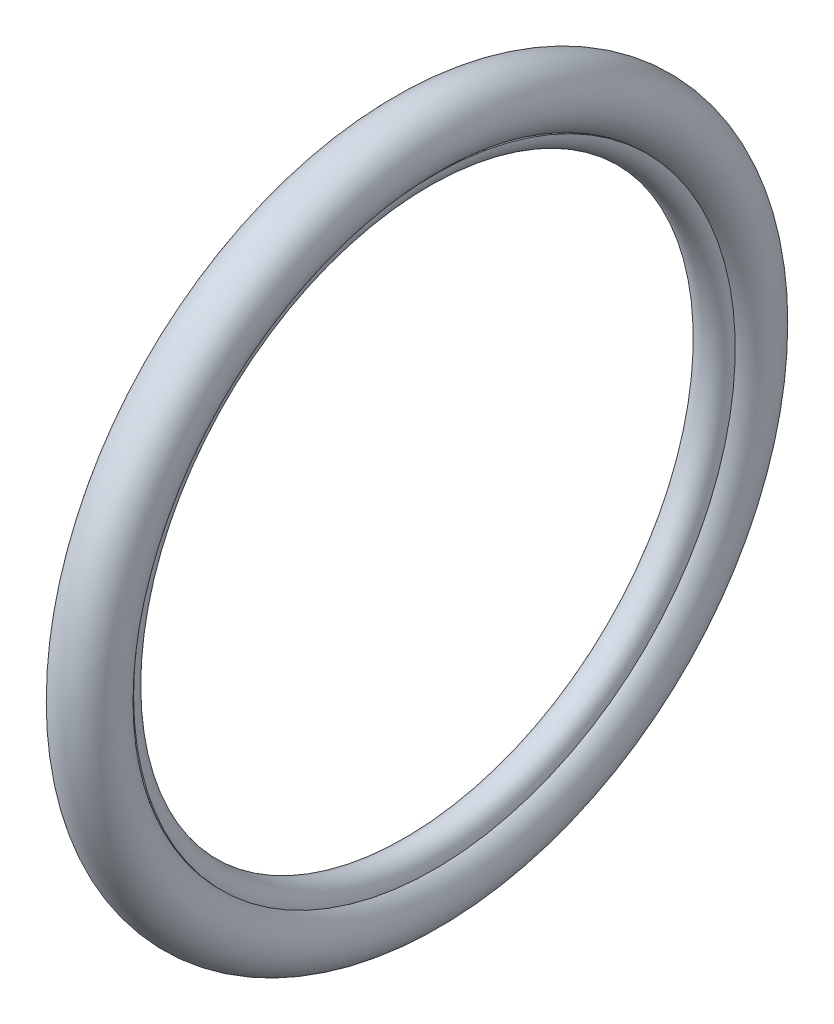
ISO-10303-21;
HEADER;
FILE_DESCRIPTION(('STEP AP214'),'2;1');
FILE_NAME('part.step','',(''),(''),'','','');
FILE_SCHEMA(('AUTOMOTIVE_DESIGN { 1 0 10303 214 1 1 1 1 }'));
ENDSEC;
DATA;
#1=APPLICATION_CONTEXT('core data for automotive mechanical design processes');
#2=APPLICATION_PROTOCOL_DEFINITION('international standard','automotive_design',2000,#1);
#3=PRODUCT_CONTEXT('',#1,'mechanical');
#4=PRODUCT('Part','Part','',(#3));
#5=PRODUCT_RELATED_PRODUCT_CATEGORY('part','',(#4));
#6=PRODUCT_DEFINITION_FORMATION('','',#4);
#7=PRODUCT_DEFINITION_CONTEXT('part definition',#1,'design');
#8=PRODUCT_DEFINITION('design','',#6,#7);
#9=PRODUCT_DEFINITION_SHAPE('','',#8);
#10=(LENGTH_UNIT() NAMED_UNIT(*) SI_UNIT(.MILLI.,.METRE.));
#11=(NAMED_UNIT(*) PLANE_ANGLE_UNIT() SI_UNIT($,.RADIAN.));
#12=(NAMED_UNIT(*) SI_UNIT($,.STERADIAN.) SOLID_ANGLE_UNIT());
#13=UNCERTAINTY_MEASURE_WITH_UNIT(LENGTH_MEASURE(1.E-05),#10,'distance_accuracy_value','');
#14=(GEOMETRIC_REPRESENTATION_CONTEXT(3) GLOBAL_UNCERTAINTY_ASSIGNED_CONTEXT((#13)) GLOBAL_UNIT_ASSIGNED_CONTEXT((#10,
#11,#12)) REPRESENTATION_CONTEXT('',''));
#15=CARTESIAN_POINT('',(0.,0.,0.));
#16=DIRECTION('',(0.,0.,1.));
#17=DIRECTION('',(1.,0.,0.));
#18=AXIS2_PLACEMENT_3D('',#15,#16,#17);
#19=CARTESIAN_POINT('',(0.,0.,0.));
#20=DIRECTION('',(-1.,0.,0.));
#21=DIRECTION('',(0.,0.,1.));
#22=AXIS2_PLACEMENT_3D('',#19,#20,#21);
#23=TOROIDAL_SURFACE('',#22,338.423757948173,31.75);
#24=CARTESIAN_POINT('',(0.,0.,370.173757948173));
#25=VERTEX_POINT('',#24);
#26=VERTEX_LOOP('',#25);
#27=FACE_BOUND('',#26,.T.);
#28=ADVANCED_FACE('F49',(#27),#23,.T.);
#29=CLOSED_SHELL('',(#28));
#30=MANIFOLD_SOLID_BREP('B2',#29);
#31=CARTESIAN_POINT('',(0.,0.,0.));
#32=DIRECTION('',(-1.,0.,0.));
#33=DIRECTION('',(0.,0.,1.));
#34=AXIS2_PLACEMENT_3D('',#31,#32,#33);
#35=TOROIDAL_SURFACE('',#34,311.,18.);
#36=CARTESIAN_POINT('',(18.,0.,0.));
#37=DIRECTION('',(-1.,0.,0.));
#38=DIRECTION('',(0.,0.,1.));
#39=AXIS2_PLACEMENT_3D('',#36,#37,#38);
#40=CIRCLE('',#39,311.);
#41=CARTESIAN_POINT('',(18.,0.,311.));
#42=VERTEX_POINT('',#41);
#43=EDGE_CURVE('E48',#42,#42,#40,.T.);
#44=ORIENTED_EDGE('',*,*,#43,.F.);
#45=EDGE_LOOP('',(#44));
#46=FACE_BOUND('',#45,.T.);
#47=CARTESIAN_POINT('',(-18.,0.,0.));
#48=DIRECTION('',(-1.,0.,0.));
#49=DIRECTION('',(0.,0.,1.));
#50=AXIS2_PLACEMENT_3D('',#47,#48,#49);
#51=CIRCLE('',#50,311.);
#52=CARTESIAN_POINT('',(-18.,0.,311.));
#53=VERTEX_POINT('',#52);
#54=EDGE_CURVE('E82',#53,#53,#51,.T.);
#55=ORIENTED_EDGE('',*,*,#54,.T.);
#56=EDGE_LOOP('',(#55));
#57=FACE_BOUND('',#56,.T.);
#58=ADVANCED_FACE('F68',(#46,#57),#35,.T.);
#59=CARTESIAN_POINT('',(-74.,0.,0.));
#60=DIRECTION('',(-1.,0.,0.));
#61=DIRECTION('',(0.,0.,1.));
#62=AXIS2_PLACEMENT_3D('',#59,#60,#61);
#63=CYLINDRICAL_SURFACE('',#62,311.);
#64=CARTESIAN_POINT('',(16.,0.,0.));
#65=DIRECTION('',(-1.,0.,0.));
#66=DIRECTION('',(0.,0.,1.));
#67=AXIS2_PLACEMENT_3D('',#64,#65,#66);
#68=CIRCLE('',#67,311.);
#69=CARTESIAN_POINT('',(16.,0.,311.));
#70=VERTEX_POINT('',#69);
#71=EDGE_CURVE('E74',#70,#70,#68,.T.);
#72=ORIENTED_EDGE('',*,*,#71,.F.);
#73=EDGE_LOOP('',(#72));
#74=FACE_BOUND('',#73,.T.);
#75=ORIENTED_EDGE('',*,*,#43,.T.);
#76=EDGE_LOOP('',(#75));
#77=FACE_BOUND('',#76,.T.);
#78=ADVANCED_FACE('F97',(#74,#77),#63,.T.);
#79=CARTESIAN_POINT('',(0.,0.,0.));
#80=DIRECTION('',(-1.,0.,0.));
#81=DIRECTION('',(0.,0.,1.));
#82=AXIS2_PLACEMENT_3D('',#79,#80,#81);
#83=TOROIDAL_SURFACE('',#82,311.,16.);
#84=CARTESIAN_POINT('',(-16.,0.,0.));
#85=DIRECTION('',(-1.,0.,0.));
#86=DIRECTION('',(0.,0.,1.));
#87=AXIS2_PLACEMENT_3D('',#84,#85,#86);
#88=CIRCLE('',#87,311.);
#89=CARTESIAN_POINT('',(-16.,0.,311.));
#90=VERTEX_POINT('',#89);
#91=EDGE_CURVE('E78',#90,#90,#88,.T.);
#92=ORIENTED_EDGE('',*,*,#91,.F.);
#93=EDGE_LOOP('',(#92));
#94=FACE_BOUND('',#93,.T.);
#95=ORIENTED_EDGE('',*,*,#71,.T.);
#96=EDGE_LOOP('',(#95));
#97=FACE_BOUND('',#96,.T.);
#98=ADVANCED_FACE('F92',(#94,#97),#83,.F.);
#99=CARTESIAN_POINT('',(-74.,0.,0.));
#100=DIRECTION('',(-1.,0.,0.));
#101=DIRECTION('',(0.,0.,1.));
#102=AXIS2_PLACEMENT_3D('',#99,#100,#101);
#103=CYLINDRICAL_SURFACE('',#102,311.);
#104=ORIENTED_EDGE('',*,*,#54,.F.);
#105=EDGE_LOOP('',(#104));
#106=FACE_BOUND('',#105,.T.);
#107=ORIENTED_EDGE('',*,*,#91,.T.);
#108=EDGE_LOOP('',(#107));
#109=FACE_BOUND('',#108,.T.);
#110=ADVANCED_FACE('F89',(#106,#109),#103,.T.);
#111=CLOSED_SHELL('',(#58,#78,#98,#110));
#112=MANIFOLD_SOLID_BREP('B6',#111);
#113=ADVANCED_BREP_SHAPE_REPRESENTATION('',(#18,#30,#112),#14);
#114=SHAPE_DEFINITION_REPRESENTATION(#9,#113);
ENDSEC;
END-ISO-10303-21;
